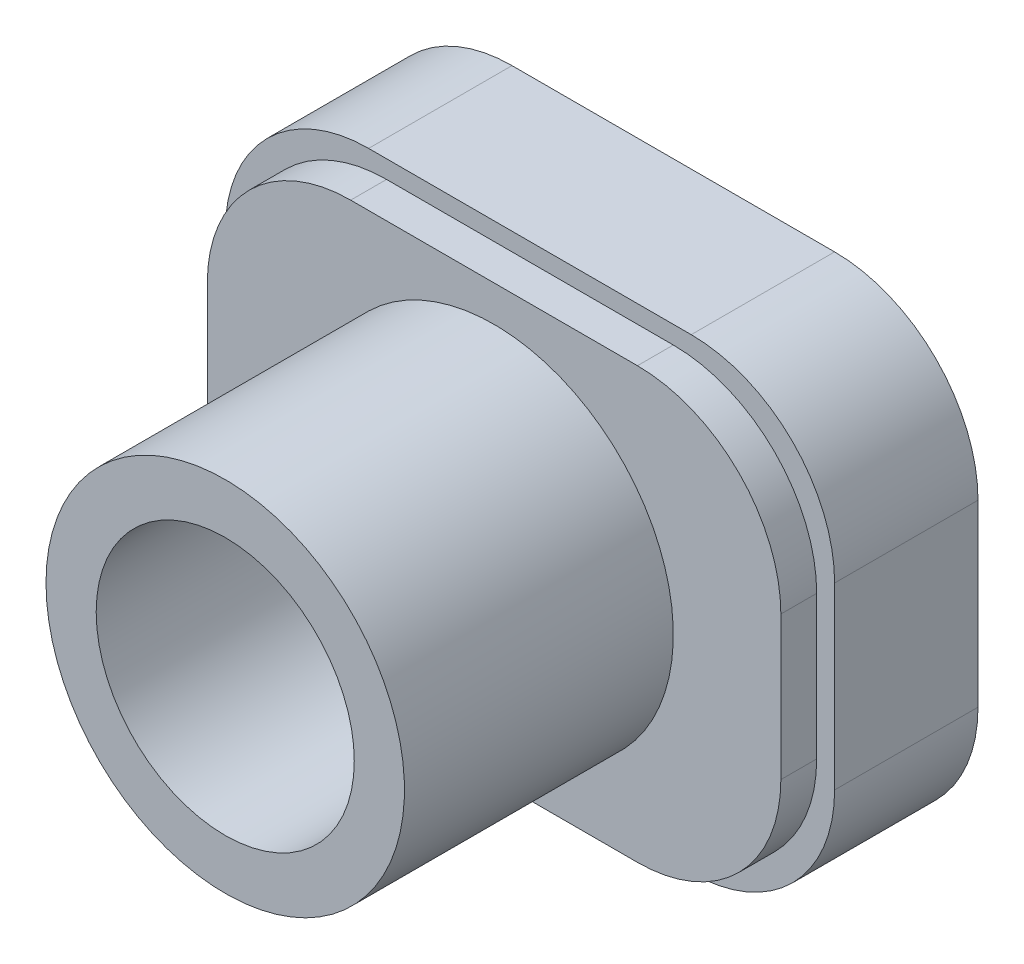
ISO-10303-21;
HEADER;
FILE_DESCRIPTION(('STEP AP214'),'2;1');
FILE_NAME('part.step','',(''),(''),'','','');
FILE_SCHEMA(('AUTOMOTIVE_DESIGN { 1 0 10303 214 1 1 1 1 }'));
ENDSEC;
DATA;
#1=APPLICATION_CONTEXT('core data for automotive mechanical design processes');
#2=APPLICATION_PROTOCOL_DEFINITION('international standard','automotive_design',2000,#1);
#3=PRODUCT_CONTEXT('',#1,'mechanical');
#4=PRODUCT('Part','Part','',(#3));
#5=PRODUCT_RELATED_PRODUCT_CATEGORY('part','',(#4));
#6=PRODUCT_DEFINITION_FORMATION('','',#4);
#7=PRODUCT_DEFINITION_CONTEXT('part definition',#1,'design');
#8=PRODUCT_DEFINITION('design','',#6,#7);
#9=PRODUCT_DEFINITION_SHAPE('','',#8);
#10=(LENGTH_UNIT() NAMED_UNIT(*) SI_UNIT(.MILLI.,.METRE.));
#11=(NAMED_UNIT(*) PLANE_ANGLE_UNIT() SI_UNIT($,.RADIAN.));
#12=(NAMED_UNIT(*) SI_UNIT($,.STERADIAN.) SOLID_ANGLE_UNIT());
#13=UNCERTAINTY_MEASURE_WITH_UNIT(LENGTH_MEASURE(1.E-05),#10,'distance_accuracy_value','');
#14=(GEOMETRIC_REPRESENTATION_CONTEXT(3) GLOBAL_UNCERTAINTY_ASSIGNED_CONTEXT((#13)) GLOBAL_UNIT_ASSIGNED_CONTEXT((#10,
#11,#12)) REPRESENTATION_CONTEXT('',''));
#15=CARTESIAN_POINT('',(0.,0.,0.));
#16=DIRECTION('',(0.,0.,1.));
#17=DIRECTION('',(1.,0.,0.));
#18=AXIS2_PLACEMENT_3D('',#15,#16,#17);
#19=CARTESIAN_POINT('',(-5.715,-3.175,5.08));
#20=DIRECTION('',(0.,0.,1.));
#21=DIRECTION('',(1.,0.,0.));
#22=AXIS2_PLACEMENT_3D('',#19,#20,#21);
#23=PLANE('',#22);
#24=CARTESIAN_POINT('',(-5.08,-2.54,5.08));
#25=DIRECTION('',(0.,0.,1.));
#26=DIRECTION('',(1.,0.,0.));
#27=AXIS2_PLACEMENT_3D('',#24,#25,#26);
#28=CIRCLE('',#27,5.08);
#29=CARTESIAN_POINT('',(-10.16,-2.53999999999996,5.08));
#30=VERTEX_POINT('',#29);
#31=CARTESIAN_POINT('',(-5.07999999999996,-7.62,5.08));
#32=VERTEX_POINT('',#31);
#33=EDGE_CURVE('E55',#30,#32,#28,.T.);
#34=ORIENTED_EDGE('',*,*,#33,.F.);
#35=DIRECTION('',(0.,-1.,0.));
#36=VECTOR('',#35,1.);
#37=CARTESIAN_POINT('',(-10.16,-2.53999999999996,5.08));
#38=LINE('',#37,#36);
#39=CARTESIAN_POINT('',(-10.16,2.53999999999996,5.08));
#40=VERTEX_POINT('',#39);
#41=EDGE_CURVE('E59',#40,#30,#38,.T.);
#42=ORIENTED_EDGE('',*,*,#41,.F.);
#43=CARTESIAN_POINT('',(-5.08,2.54,5.08));
#44=DIRECTION('',(0.,0.,1.));
#45=DIRECTION('',(-1.,0.,0.));
#46=AXIS2_PLACEMENT_3D('',#43,#44,#45);
#47=CIRCLE('',#46,5.08);
#48=CARTESIAN_POINT('',(-5.07999999999997,7.62,5.08));
#49=VERTEX_POINT('',#48);
#50=EDGE_CURVE('E662',#49,#40,#47,.T.);
#51=ORIENTED_EDGE('',*,*,#50,.F.);
#52=DIRECTION('',(-1.,0.,0.));
#53=VECTOR('',#52,1.);
#54=CARTESIAN_POINT('',(5.07999999999996,7.62,5.08));
#55=LINE('',#54,#53);
#56=CARTESIAN_POINT('',(5.07999999999996,7.62,5.08));
#57=VERTEX_POINT('',#56);
#58=EDGE_CURVE('E659',#57,#49,#55,.T.);
#59=ORIENTED_EDGE('',*,*,#58,.F.);
#60=CARTESIAN_POINT('',(5.08,2.54,5.08));
#61=DIRECTION('',(0.,0.,1.));
#62=DIRECTION('',(1.,0.,0.));
#63=AXIS2_PLACEMENT_3D('',#60,#61,#62);
#64=CIRCLE('',#63,5.08);
#65=CARTESIAN_POINT('',(10.16,2.53999999999996,5.08));
#66=VERTEX_POINT('',#65);
#67=EDGE_CURVE('E656',#66,#57,#64,.T.);
#68=ORIENTED_EDGE('',*,*,#67,.F.);
#69=DIRECTION('',(0.,1.,0.));
#70=VECTOR('',#69,1.);
#71=CARTESIAN_POINT('',(10.16,-2.53999999999996,5.08));
#72=LINE('',#71,#70);
#73=CARTESIAN_POINT('',(10.16,-2.53999999999996,5.08));
#74=VERTEX_POINT('',#73);
#75=EDGE_CURVE('E653',#74,#66,#72,.T.);
#76=ORIENTED_EDGE('',*,*,#75,.F.);
#77=CARTESIAN_POINT('',(5.08,-2.54,5.08));
#78=DIRECTION('',(0.,0.,1.));
#79=DIRECTION('',(1.,0.,0.));
#80=AXIS2_PLACEMENT_3D('',#77,#78,#79);
#81=CIRCLE('',#80,5.08);
#82=CARTESIAN_POINT('',(5.07999999999996,-7.62,5.08));
#83=VERTEX_POINT('',#82);
#84=EDGE_CURVE('E650',#83,#74,#81,.T.);
#85=ORIENTED_EDGE('',*,*,#84,.F.);
#86=DIRECTION('',(1.,0.,0.));
#87=VECTOR('',#86,1.);
#88=CARTESIAN_POINT('',(5.07999999999996,-7.62,5.08));
#89=LINE('',#88,#87);
#90=EDGE_CURVE('E648',#32,#83,#89,.T.);
#91=ORIENTED_EDGE('',*,*,#90,.F.);
#92=EDGE_LOOP('',(#34,#42,#51,#59,#68,#76,#85,#91));
#93=FACE_BOUND('',#92,.T.);
#94=CARTESIAN_POINT('',(-5.715,-3.175,5.08));
#95=DIRECTION('',(0.,0.,1.));
#96=DIRECTION('',(1.,0.,0.));
#97=AXIS2_PLACEMENT_3D('',#94,#95,#96);
#98=CIRCLE('',#97,5.08);
#99=CARTESIAN_POINT('',(-10.795,-3.17499999999997,5.08));
#100=VERTEX_POINT('',#99);
#101=CARTESIAN_POINT('',(-5.71499999999996,-8.255,5.08));
#102=VERTEX_POINT('',#101);
#103=EDGE_CURVE('E293',#100,#102,#98,.T.);
#104=ORIENTED_EDGE('',*,*,#103,.T.);
#105=DIRECTION('',(1.,0.,0.));
#106=VECTOR('',#105,1.);
#107=CARTESIAN_POINT('',(5.71499999999996,-8.255,5.08));
#108=LINE('',#107,#106);
#109=CARTESIAN_POINT('',(5.71499999999996,-8.255,5.08));
#110=VERTEX_POINT('',#109);
#111=EDGE_CURVE('E296',#102,#110,#108,.T.);
#112=ORIENTED_EDGE('',*,*,#111,.T.);
#113=CARTESIAN_POINT('',(5.715,-3.175,5.08));
#114=DIRECTION('',(0.,0.,1.));
#115=DIRECTION('',(1.,0.,0.));
#116=AXIS2_PLACEMENT_3D('',#113,#114,#115);
#117=CIRCLE('',#116,5.08);
#118=CARTESIAN_POINT('',(10.795,-3.17499999999996,5.08));
#119=VERTEX_POINT('',#118);
#120=EDGE_CURVE('E299',#110,#119,#117,.T.);
#121=ORIENTED_EDGE('',*,*,#120,.T.);
#122=DIRECTION('',(0.,1.,0.));
#123=VECTOR('',#122,1.);
#124=CARTESIAN_POINT('',(10.795,-3.17499999999996,5.08));
#125=LINE('',#124,#123);
#126=CARTESIAN_POINT('',(10.795,3.17499999999997,5.08));
#127=VERTEX_POINT('',#126);
#128=EDGE_CURVE('E301',#119,#127,#125,.T.);
#129=ORIENTED_EDGE('',*,*,#128,.T.);
#130=CARTESIAN_POINT('',(5.715,3.175,5.08));
#131=DIRECTION('',(0.,0.,1.));
#132=DIRECTION('',(1.,0.,0.));
#133=AXIS2_PLACEMENT_3D('',#130,#131,#132);
#134=CIRCLE('',#133,5.08);
#135=CARTESIAN_POINT('',(5.71499999999996,8.255,5.08));
#136=VERTEX_POINT('',#135);
#137=EDGE_CURVE('E303',#127,#136,#134,.T.);
#138=ORIENTED_EDGE('',*,*,#137,.T.);
#139=DIRECTION('',(-1.,0.,0.));
#140=VECTOR('',#139,1.);
#141=CARTESIAN_POINT('',(5.71499999999996,8.255,5.08));
#142=LINE('',#141,#140);
#143=CARTESIAN_POINT('',(-5.71499999999996,8.255,5.08));
#144=VERTEX_POINT('',#143);
#145=EDGE_CURVE('E305',#136,#144,#142,.T.);
#146=ORIENTED_EDGE('',*,*,#145,.T.);
#147=CARTESIAN_POINT('',(-5.715,3.175,5.08));
#148=DIRECTION('',(0.,0.,1.));
#149=DIRECTION('',(-1.,0.,0.));
#150=AXIS2_PLACEMENT_3D('',#147,#148,#149);
#151=CIRCLE('',#150,5.08);
#152=CARTESIAN_POINT('',(-10.795,3.17499999999997,5.08));
#153=VERTEX_POINT('',#152);
#154=EDGE_CURVE('E307',#144,#153,#151,.T.);
#155=ORIENTED_EDGE('',*,*,#154,.T.);
#156=DIRECTION('',(0.,-1.,0.));
#157=VECTOR('',#156,1.);
#158=CARTESIAN_POINT('',(-10.795,-3.17499999999997,5.08));
#159=LINE('',#158,#157);
#160=EDGE_CURVE('E309',#153,#100,#159,.T.);
#161=ORIENTED_EDGE('',*,*,#160,.T.);
#162=EDGE_LOOP('',(#104,#112,#121,#129,#138,#146,#155,#161));
#163=FACE_BOUND('',#162,.T.);
#164=ADVANCED_FACE('F39',(#93,#163),#23,.T.);
#165=CARTESIAN_POINT('',(-5.715,-3.175,0.));
#166=DIRECTION('',(0.,0.,1.));
#167=DIRECTION('',(1.,0.,0.));
#168=AXIS2_PLACEMENT_3D('',#165,#166,#167);
#169=PLANE('',#168);
#170=CARTESIAN_POINT('',(-5.715,-3.175,0.));
#171=DIRECTION('',(0.,0.,1.));
#172=DIRECTION('',(1.,0.,0.));
#173=AXIS2_PLACEMENT_3D('',#170,#171,#172);
#174=CIRCLE('',#173,5.08);
#175=CARTESIAN_POINT('',(-10.795,-3.17499999999997,0.));
#176=VERTEX_POINT('',#175);
#177=CARTESIAN_POINT('',(-5.71499999999996,-8.255,0.));
#178=VERTEX_POINT('',#177);
#179=EDGE_CURVE('E292',#176,#178,#174,.T.);
#180=ORIENTED_EDGE('',*,*,#179,.F.);
#181=DIRECTION('',(0.,-1.,0.));
#182=VECTOR('',#181,1.);
#183=CARTESIAN_POINT('',(-10.795,-3.17499999999997,0.));
#184=LINE('',#183,#182);
#185=CARTESIAN_POINT('',(-10.795,3.17499999999997,0.));
#186=VERTEX_POINT('',#185);
#187=EDGE_CURVE('E297',#186,#176,#184,.T.);
#188=ORIENTED_EDGE('',*,*,#187,.F.);
#189=CARTESIAN_POINT('',(-5.715,3.175,0.));
#190=DIRECTION('',(0.,0.,1.));
#191=DIRECTION('',(-1.,0.,0.));
#192=AXIS2_PLACEMENT_3D('',#189,#190,#191);
#193=CIRCLE('',#192,5.08);
#194=CARTESIAN_POINT('',(-5.71499999999996,8.255,0.));
#195=VERTEX_POINT('',#194);
#196=EDGE_CURVE('E324',#195,#186,#193,.T.);
#197=ORIENTED_EDGE('',*,*,#196,.F.);
#198=DIRECTION('',(-1.,0.,0.));
#199=VECTOR('',#198,1.);
#200=CARTESIAN_POINT('',(5.71499999999996,8.255,0.));
#201=LINE('',#200,#199);
#202=CARTESIAN_POINT('',(5.71499999999996,8.255,0.));
#203=VERTEX_POINT('',#202);
#204=EDGE_CURVE('E322',#203,#195,#201,.T.);
#205=ORIENTED_EDGE('',*,*,#204,.F.);
#206=CARTESIAN_POINT('',(5.715,3.175,0.));
#207=DIRECTION('',(0.,0.,1.));
#208=DIRECTION('',(1.,0.,0.));
#209=AXIS2_PLACEMENT_3D('',#206,#207,#208);
#210=CIRCLE('',#209,5.08);
#211=CARTESIAN_POINT('',(10.795,3.17499999999997,0.));
#212=VERTEX_POINT('',#211);
#213=EDGE_CURVE('E320',#212,#203,#210,.T.);
#214=ORIENTED_EDGE('',*,*,#213,.F.);
#215=DIRECTION('',(0.,1.,0.));
#216=VECTOR('',#215,1.);
#217=CARTESIAN_POINT('',(10.795,-3.17499999999996,0.));
#218=LINE('',#217,#216);
#219=CARTESIAN_POINT('',(10.795,-3.17499999999996,0.));
#220=VERTEX_POINT('',#219);
#221=EDGE_CURVE('E318',#220,#212,#218,.T.);
#222=ORIENTED_EDGE('',*,*,#221,.F.);
#223=CARTESIAN_POINT('',(5.715,-3.175,0.));
#224=DIRECTION('',(0.,0.,1.));
#225=DIRECTION('',(1.,0.,0.));
#226=AXIS2_PLACEMENT_3D('',#223,#224,#225);
#227=CIRCLE('',#226,5.08);
#228=CARTESIAN_POINT('',(5.71499999999996,-8.255,0.));
#229=VERTEX_POINT('',#228);
#230=EDGE_CURVE('E316',#229,#220,#227,.T.);
#231=ORIENTED_EDGE('',*,*,#230,.F.);
#232=DIRECTION('',(1.,0.,0.));
#233=VECTOR('',#232,1.);
#234=CARTESIAN_POINT('',(5.71499999999996,-8.255,0.));
#235=LINE('',#234,#233);
#236=EDGE_CURVE('E314',#178,#229,#235,.T.);
#237=ORIENTED_EDGE('',*,*,#236,.F.);
#238=EDGE_LOOP('',(#180,#188,#197,#205,#214,#222,#231,#237));
#239=FACE_BOUND('',#238,.T.);
#240=CARTESIAN_POINT('',(3.67,0.919999999999998,0.));
#241=DIRECTION('',(0.,0.,1.));
#242=DIRECTION('',(-1.,0.,0.));
#243=AXIS2_PLACEMENT_3D('',#240,#241,#242);
#244=CIRCLE('',#243,5.08);
#245=CARTESIAN_POINT('',(8.75,0.919999999999998,0.));
#246=VERTEX_POINT('',#245);
#247=CARTESIAN_POINT('',(3.67,6.,0.));
#248=VERTEX_POINT('',#247);
#249=EDGE_CURVE('E221',#246,#248,#244,.T.);
#250=ORIENTED_EDGE('',*,*,#249,.T.);
#251=DIRECTION('',(-1.,0.,0.));
#252=VECTOR('',#251,1.);
#253=CARTESIAN_POINT('',(3.67,6.,0.));
#254=LINE('',#253,#252);
#255=CARTESIAN_POINT('',(-3.67,6.,0.));
#256=VERTEX_POINT('',#255);
#257=EDGE_CURVE('E224',#248,#256,#254,.T.);
#258=ORIENTED_EDGE('',*,*,#257,.T.);
#259=CARTESIAN_POINT('',(-3.67,0.919999999999997,0.));
#260=DIRECTION('',(0.,0.,1.));
#261=DIRECTION('',(-1.,0.,0.));
#262=AXIS2_PLACEMENT_3D('',#259,#260,#261);
#263=CIRCLE('',#262,5.08);
#264=CARTESIAN_POINT('',(-8.75,0.919999999999997,0.));
#265=VERTEX_POINT('',#264);
#266=EDGE_CURVE('E258',#256,#265,#263,.T.);
#267=ORIENTED_EDGE('',*,*,#266,.T.);
#268=DIRECTION('',(0.,-1.,0.));
#269=VECTOR('',#268,1.);
#270=CARTESIAN_POINT('',(-8.75,-0.920000000000002,0.));
#271=LINE('',#270,#269);
#272=CARTESIAN_POINT('',(-8.75,-0.920000000000002,0.));
#273=VERTEX_POINT('',#272);
#274=EDGE_CURVE('E261',#265,#273,#271,.T.);
#275=ORIENTED_EDGE('',*,*,#274,.T.);
#276=CARTESIAN_POINT('',(-3.67,-0.920000000000002,0.));
#277=DIRECTION('',(0.,0.,1.));
#278=DIRECTION('',(-1.,0.,0.));
#279=AXIS2_PLACEMENT_3D('',#276,#277,#278);
#280=CIRCLE('',#279,5.08);
#281=CARTESIAN_POINT('',(-3.67,-6.,0.));
#282=VERTEX_POINT('',#281);
#283=EDGE_CURVE('E264',#273,#282,#280,.T.);
#284=ORIENTED_EDGE('',*,*,#283,.T.);
#285=DIRECTION('',(1.,0.,0.));
#286=VECTOR('',#285,1.);
#287=CARTESIAN_POINT('',(3.67,-6.,0.));
#288=LINE('',#287,#286);
#289=CARTESIAN_POINT('',(3.67,-6.,0.));
#290=VERTEX_POINT('',#289);
#291=EDGE_CURVE('E267',#282,#290,#288,.T.);
#292=ORIENTED_EDGE('',*,*,#291,.T.);
#293=CARTESIAN_POINT('',(3.67,-0.920000000000002,0.));
#294=DIRECTION('',(0.,0.,1.));
#295=DIRECTION('',(-1.,0.,0.));
#296=AXIS2_PLACEMENT_3D('',#293,#294,#295);
#297=CIRCLE('',#296,5.08);
#298=CARTESIAN_POINT('',(8.75,-0.920000000000001,0.));
#299=VERTEX_POINT('',#298);
#300=EDGE_CURVE('E270',#290,#299,#297,.T.);
#301=ORIENTED_EDGE('',*,*,#300,.T.);
#302=DIRECTION('',(0.,1.,0.));
#303=VECTOR('',#302,1.);
#304=CARTESIAN_POINT('',(8.75,-0.920000000000002,0.));
#305=LINE('',#304,#303);
#306=EDGE_CURVE('E234',#299,#246,#305,.T.);
#307=ORIENTED_EDGE('',*,*,#306,.T.);
#308=EDGE_LOOP('',(#250,#258,#267,#275,#284,#292,#301,#307));
#309=FACE_BOUND('',#308,.T.);
#310=ADVANCED_FACE('F359',(#239,#309),#169,.F.);
#311=CARTESIAN_POINT('',(-5.715,-3.175,5.08));
#312=DIRECTION('',(0.,0.,-1.));
#313=DIRECTION('',(-1.,0.,0.));
#314=AXIS2_PLACEMENT_3D('',#311,#312,#313);
#315=CYLINDRICAL_SURFACE('',#314,5.08);
#316=ORIENTED_EDGE('',*,*,#179,.T.);
#317=DIRECTION('',(0.,0.,-1.));
#318=VECTOR('',#317,1.);
#319=CARTESIAN_POINT('',(-5.71499999999996,-8.255,5.08));
#320=LINE('',#319,#318);
#321=EDGE_CURVE('E43',#102,#178,#320,.T.);
#322=ORIENTED_EDGE('',*,*,#321,.F.);
#323=ORIENTED_EDGE('',*,*,#103,.F.);
#324=DIRECTION('',(0.,0.,-1.));
#325=VECTOR('',#324,1.);
#326=CARTESIAN_POINT('',(-10.795,-3.17499999999997,5.08));
#327=LINE('',#326,#325);
#328=EDGE_CURVE('E311',#100,#176,#327,.T.);
#329=ORIENTED_EDGE('',*,*,#328,.T.);
#330=EDGE_LOOP('',(#316,#322,#323,#329));
#331=FACE_BOUND('',#330,.T.);
#332=ADVANCED_FACE('F41',(#331),#315,.T.);
#333=CARTESIAN_POINT('',(5.71499999999996,-8.255,5.08));
#334=DIRECTION('',(0.,1.,0.));
#335=DIRECTION('',(-1.,0.,0.));
#336=AXIS2_PLACEMENT_3D('',#333,#334,#335);
#337=PLANE('',#336);
#338=ORIENTED_EDGE('',*,*,#236,.T.);
#339=DIRECTION('',(0.,0.,-1.));
#340=VECTOR('',#339,1.);
#341=CARTESIAN_POINT('',(5.71499999999996,-8.255,5.08));
#342=LINE('',#341,#340);
#343=EDGE_CURVE('E343',#110,#229,#342,.T.);
#344=ORIENTED_EDGE('',*,*,#343,.F.);
#345=ORIENTED_EDGE('',*,*,#111,.F.);
#346=ORIENTED_EDGE('',*,*,#321,.T.);
#347=EDGE_LOOP('',(#338,#344,#345,#346));
#348=FACE_BOUND('',#347,.T.);
#349=ADVANCED_FACE('F352',(#348),#337,.F.);
#350=CARTESIAN_POINT('',(5.715,-3.175,5.08));
#351=DIRECTION('',(0.,0.,-1.));
#352=DIRECTION('',(-1.,0.,0.));
#353=AXIS2_PLACEMENT_3D('',#350,#351,#352);
#354=CYLINDRICAL_SURFACE('',#353,5.08);
#355=ORIENTED_EDGE('',*,*,#230,.T.);
#356=DIRECTION('',(0.,0.,-1.));
#357=VECTOR('',#356,1.);
#358=CARTESIAN_POINT('',(10.795,-3.17499999999996,5.08));
#359=LINE('',#358,#357);
#360=EDGE_CURVE('E341',#119,#220,#359,.T.);
#361=ORIENTED_EDGE('',*,*,#360,.F.);
#362=ORIENTED_EDGE('',*,*,#120,.F.);
#363=ORIENTED_EDGE('',*,*,#343,.T.);
#364=EDGE_LOOP('',(#355,#361,#362,#363));
#365=FACE_BOUND('',#364,.T.);
#366=ADVANCED_FACE('F365',(#365),#354,.T.);
#367=CARTESIAN_POINT('',(10.795,-3.17499999999996,5.08));
#368=DIRECTION('',(-1.,0.,0.));
#369=DIRECTION('',(0.,0.,1.));
#370=AXIS2_PLACEMENT_3D('',#367,#368,#369);
#371=PLANE('',#370);
#372=ORIENTED_EDGE('',*,*,#221,.T.);
#373=DIRECTION('',(0.,0.,-1.));
#374=VECTOR('',#373,1.);
#375=CARTESIAN_POINT('',(10.795,3.17499999999997,5.08));
#376=LINE('',#375,#374);
#377=EDGE_CURVE('E338',#127,#212,#376,.T.);
#378=ORIENTED_EDGE('',*,*,#377,.F.);
#379=ORIENTED_EDGE('',*,*,#128,.F.);
#380=ORIENTED_EDGE('',*,*,#360,.T.);
#381=EDGE_LOOP('',(#372,#378,#379,#380));
#382=FACE_BOUND('',#381,.T.);
#383=ADVANCED_FACE('F368',(#382),#371,.F.);
#384=CARTESIAN_POINT('',(5.715,3.175,5.08));
#385=DIRECTION('',(0.,0.,-1.));
#386=DIRECTION('',(-1.,0.,0.));
#387=AXIS2_PLACEMENT_3D('',#384,#385,#386);
#388=CYLINDRICAL_SURFACE('',#387,5.08);
#389=ORIENTED_EDGE('',*,*,#213,.T.);
#390=DIRECTION('',(0.,0.,-1.));
#391=VECTOR('',#390,1.);
#392=CARTESIAN_POINT('',(5.71499999999996,8.255,5.08));
#393=LINE('',#392,#391);
#394=EDGE_CURVE('E335',#136,#203,#393,.T.);
#395=ORIENTED_EDGE('',*,*,#394,.F.);
#396=ORIENTED_EDGE('',*,*,#137,.F.);
#397=ORIENTED_EDGE('',*,*,#377,.T.);
#398=EDGE_LOOP('',(#389,#395,#396,#397));
#399=FACE_BOUND('',#398,.T.);
#400=ADVANCED_FACE('F386',(#399),#388,.T.);
#401=CARTESIAN_POINT('',(5.71499999999996,8.255,5.08));
#402=DIRECTION('',(0.,-1.,0.));
#403=DIRECTION('',(1.,0.,0.));
#404=AXIS2_PLACEMENT_3D('',#401,#402,#403);
#405=PLANE('',#404);
#406=ORIENTED_EDGE('',*,*,#204,.T.);
#407=DIRECTION('',(0.,0.,-1.));
#408=VECTOR('',#407,1.);
#409=CARTESIAN_POINT('',(-5.71499999999996,8.255,5.08));
#410=LINE('',#409,#408);
#411=EDGE_CURVE('E332',#144,#195,#410,.T.);
#412=ORIENTED_EDGE('',*,*,#411,.F.);
#413=ORIENTED_EDGE('',*,*,#145,.F.);
#414=ORIENTED_EDGE('',*,*,#394,.T.);
#415=EDGE_LOOP('',(#406,#412,#413,#414));
#416=FACE_BOUND('',#415,.T.);
#417=ADVANCED_FACE('F383',(#416),#405,.F.);
#418=CARTESIAN_POINT('',(-5.715,3.175,5.08));
#419=DIRECTION('',(0.,0.,-1.));
#420=DIRECTION('',(-1.,0.,0.));
#421=AXIS2_PLACEMENT_3D('',#418,#419,#420);
#422=CYLINDRICAL_SURFACE('',#421,5.08);
#423=ORIENTED_EDGE('',*,*,#196,.T.);
#424=DIRECTION('',(0.,0.,-1.));
#425=VECTOR('',#424,1.);
#426=CARTESIAN_POINT('',(-10.795,3.17499999999997,5.08));
#427=LINE('',#426,#425);
#428=EDGE_CURVE('E329',#153,#186,#427,.T.);
#429=ORIENTED_EDGE('',*,*,#428,.F.);
#430=ORIENTED_EDGE('',*,*,#154,.F.);
#431=ORIENTED_EDGE('',*,*,#411,.T.);
#432=EDGE_LOOP('',(#423,#429,#430,#431));
#433=FACE_BOUND('',#432,.T.);
#434=ADVANCED_FACE('F379',(#433),#422,.T.);
#435=CARTESIAN_POINT('',(-10.795,-3.17499999999997,5.08));
#436=DIRECTION('',(1.,0.,0.));
#437=DIRECTION('',(0.,0.,-1.));
#438=AXIS2_PLACEMENT_3D('',#435,#436,#437);
#439=PLANE('',#438);
#440=ORIENTED_EDGE('',*,*,#187,.T.);
#441=ORIENTED_EDGE('',*,*,#328,.F.);
#442=ORIENTED_EDGE('',*,*,#160,.F.);
#443=ORIENTED_EDGE('',*,*,#428,.T.);
#444=EDGE_LOOP('',(#440,#441,#442,#443));
#445=FACE_BOUND('',#444,.T.);
#446=ADVANCED_FACE('F377',(#445),#439,.F.);
#447=CARTESIAN_POINT('',(3.67,0.919999999999998,5.08));
#448=DIRECTION('',(0.,0.,-1.));
#449=DIRECTION('',(-1.,0.,0.));
#450=AXIS2_PLACEMENT_3D('',#447,#448,#449);
#451=CYLINDRICAL_SURFACE('',#450,5.08);
#452=ORIENTED_EDGE('',*,*,#249,.F.);
#453=DIRECTION('',(0.,0.,-1.));
#454=VECTOR('',#453,1.);
#455=CARTESIAN_POINT('',(8.75,0.919999999999998,5.08));
#456=LINE('',#455,#454);
#457=CARTESIAN_POINT('',(8.75,0.919999999999998,5.08));
#458=VERTEX_POINT('',#457);
#459=EDGE_CURVE('E254',#458,#246,#456,.T.);
#460=ORIENTED_EDGE('',*,*,#459,.F.);
#461=CARTESIAN_POINT('',(3.67,0.919999999999998,5.08));
#462=DIRECTION('',(0.,0.,1.));
#463=DIRECTION('',(-1.,0.,0.));
#464=AXIS2_PLACEMENT_3D('',#461,#462,#463);
#465=CIRCLE('',#464,5.08);
#466=CARTESIAN_POINT('',(3.67,6.,5.08));
#467=VERTEX_POINT('',#466);
#468=EDGE_CURVE('E230',#458,#467,#465,.T.);
#469=ORIENTED_EDGE('',*,*,#468,.T.);
#470=DIRECTION('',(0.,0.,-1.));
#471=VECTOR('',#470,1.);
#472=CARTESIAN_POINT('',(3.67,6.,5.08));
#473=LINE('',#472,#471);
#474=EDGE_CURVE('E289',#467,#248,#473,.T.);
#475=ORIENTED_EDGE('',*,*,#474,.T.);
#476=EDGE_LOOP('',(#452,#460,#469,#475));
#477=FACE_BOUND('',#476,.T.);
#478=ADVANCED_FACE('F404',(#477),#451,.F.);
#479=CARTESIAN_POINT('',(3.67,6.,5.08));
#480=DIRECTION('',(0.,-1.,0.));
#481=DIRECTION('',(1.,0.,0.));
#482=AXIS2_PLACEMENT_3D('',#479,#480,#481);
#483=PLANE('',#482);
#484=ORIENTED_EDGE('',*,*,#257,.F.);
#485=ORIENTED_EDGE('',*,*,#474,.F.);
#486=DIRECTION('',(-1.,0.,0.));
#487=VECTOR('',#486,1.);
#488=CARTESIAN_POINT('',(3.67,6.,5.08));
#489=LINE('',#488,#487);
#490=CARTESIAN_POINT('',(-3.67,6.,5.08));
#491=VERTEX_POINT('',#490);
#492=EDGE_CURVE('E233',#467,#491,#489,.T.);
#493=ORIENTED_EDGE('',*,*,#492,.T.);
#494=DIRECTION('',(0.,0.,-1.));
#495=VECTOR('',#494,1.);
#496=CARTESIAN_POINT('',(-3.67,6.,5.08));
#497=LINE('',#496,#495);
#498=EDGE_CURVE('E287',#491,#256,#497,.T.);
#499=ORIENTED_EDGE('',*,*,#498,.T.);
#500=EDGE_LOOP('',(#484,#485,#493,#499));
#501=FACE_BOUND('',#500,.T.);
#502=ADVANCED_FACE('F427',(#501),#483,.T.);
#503=CARTESIAN_POINT('',(-3.67,0.919999999999997,5.08));
#504=DIRECTION('',(0.,0.,-1.));
#505=DIRECTION('',(-1.,0.,0.));
#506=AXIS2_PLACEMENT_3D('',#503,#504,#505);
#507=CYLINDRICAL_SURFACE('',#506,5.08);
#508=ORIENTED_EDGE('',*,*,#266,.F.);
#509=ORIENTED_EDGE('',*,*,#498,.F.);
#510=CARTESIAN_POINT('',(-3.67,0.919999999999997,5.08));
#511=DIRECTION('',(0.,0.,1.));
#512=DIRECTION('',(-1.,0.,0.));
#513=AXIS2_PLACEMENT_3D('',#510,#511,#512);
#514=CIRCLE('',#513,5.08);
#515=CARTESIAN_POINT('',(-8.75,0.919999999999997,5.08));
#516=VERTEX_POINT('',#515);
#517=EDGE_CURVE('E237',#491,#516,#514,.T.);
#518=ORIENTED_EDGE('',*,*,#517,.T.);
#519=DIRECTION('',(0.,0.,-1.));
#520=VECTOR('',#519,1.);
#521=CARTESIAN_POINT('',(-8.75,0.919999999999997,5.08));
#522=LINE('',#521,#520);
#523=EDGE_CURVE('E285',#516,#265,#522,.T.);
#524=ORIENTED_EDGE('',*,*,#523,.T.);
#525=EDGE_LOOP('',(#508,#509,#518,#524));
#526=FACE_BOUND('',#525,.T.);
#527=ADVANCED_FACE('F436',(#526),#507,.F.);
#528=CARTESIAN_POINT('',(-8.75,-0.920000000000002,5.08));
#529=DIRECTION('',(1.,0.,0.));
#530=DIRECTION('',(0.,1.,0.));
#531=AXIS2_PLACEMENT_3D('',#528,#529,#530);
#532=PLANE('',#531);
#533=ORIENTED_EDGE('',*,*,#274,.F.);
#534=ORIENTED_EDGE('',*,*,#523,.F.);
#535=DIRECTION('',(0.,-1.,0.));
#536=VECTOR('',#535,1.);
#537=CARTESIAN_POINT('',(-8.75,-0.920000000000002,5.08));
#538=LINE('',#537,#536);
#539=CARTESIAN_POINT('',(-8.75,-0.920000000000002,5.08));
#540=VERTEX_POINT('',#539);
#541=EDGE_CURVE('E240',#516,#540,#538,.T.);
#542=ORIENTED_EDGE('',*,*,#541,.T.);
#543=DIRECTION('',(0.,0.,-1.));
#544=VECTOR('',#543,1.);
#545=CARTESIAN_POINT('',(-8.75,-0.920000000000002,5.08));
#546=LINE('',#545,#544);
#547=EDGE_CURVE('E283',#540,#273,#546,.T.);
#548=ORIENTED_EDGE('',*,*,#547,.T.);
#549=EDGE_LOOP('',(#533,#534,#542,#548));
#550=FACE_BOUND('',#549,.T.);
#551=ADVANCED_FACE('F445',(#550),#532,.T.);
#552=CARTESIAN_POINT('',(-3.67,-0.920000000000002,5.08));
#553=DIRECTION('',(0.,0.,-1.));
#554=DIRECTION('',(-1.,0.,0.));
#555=AXIS2_PLACEMENT_3D('',#552,#553,#554);
#556=CYLINDRICAL_SURFACE('',#555,5.08);
#557=ORIENTED_EDGE('',*,*,#283,.F.);
#558=ORIENTED_EDGE('',*,*,#547,.F.);
#559=CARTESIAN_POINT('',(-3.67,-0.920000000000002,5.08));
#560=DIRECTION('',(0.,0.,1.));
#561=DIRECTION('',(-1.,0.,0.));
#562=AXIS2_PLACEMENT_3D('',#559,#560,#561);
#563=CIRCLE('',#562,5.08);
#564=CARTESIAN_POINT('',(-3.67,-6.,5.08));
#565=VERTEX_POINT('',#564);
#566=EDGE_CURVE('E243',#540,#565,#563,.T.);
#567=ORIENTED_EDGE('',*,*,#566,.T.);
#568=DIRECTION('',(0.,0.,-1.));
#569=VECTOR('',#568,1.);
#570=CARTESIAN_POINT('',(-3.67,-6.,5.08));
#571=LINE('',#570,#569);
#572=EDGE_CURVE('E281',#565,#282,#571,.T.);
#573=ORIENTED_EDGE('',*,*,#572,.T.);
#574=EDGE_LOOP('',(#557,#558,#567,#573));
#575=FACE_BOUND('',#574,.T.);
#576=ADVANCED_FACE('F455',(#575),#556,.F.);
#577=CARTESIAN_POINT('',(3.67,-6.,5.08));
#578=DIRECTION('',(0.,1.,0.));
#579=DIRECTION('',(-1.,0.,0.));
#580=AXIS2_PLACEMENT_3D('',#577,#578,#579);
#581=PLANE('',#580);
#582=ORIENTED_EDGE('',*,*,#291,.F.);
#583=ORIENTED_EDGE('',*,*,#572,.F.);
#584=DIRECTION('',(1.,0.,0.));
#585=VECTOR('',#584,1.);
#586=CARTESIAN_POINT('',(3.67,-6.,5.08));
#587=LINE('',#586,#585);
#588=CARTESIAN_POINT('',(3.67,-6.,5.08));
#589=VERTEX_POINT('',#588);
#590=EDGE_CURVE('E246',#565,#589,#587,.T.);
#591=ORIENTED_EDGE('',*,*,#590,.T.);
#592=DIRECTION('',(0.,0.,-1.));
#593=VECTOR('',#592,1.);
#594=CARTESIAN_POINT('',(3.67,-6.,5.08));
#595=LINE('',#594,#593);
#596=EDGE_CURVE('E279',#589,#290,#595,.T.);
#597=ORIENTED_EDGE('',*,*,#596,.T.);
#598=EDGE_LOOP('',(#582,#583,#591,#597));
#599=FACE_BOUND('',#598,.T.);
#600=ADVANCED_FACE('F465',(#599),#581,.T.);
#601=CARTESIAN_POINT('',(3.67,-0.920000000000002,5.08));
#602=DIRECTION('',(0.,0.,-1.));
#603=DIRECTION('',(-1.,0.,0.));
#604=AXIS2_PLACEMENT_3D('',#601,#602,#603);
#605=CYLINDRICAL_SURFACE('',#604,5.08);
#606=ORIENTED_EDGE('',*,*,#300,.F.);
#607=ORIENTED_EDGE('',*,*,#596,.F.);
#608=CARTESIAN_POINT('',(3.67,-0.920000000000002,5.08));
#609=DIRECTION('',(0.,0.,1.));
#610=DIRECTION('',(-1.,0.,0.));
#611=AXIS2_PLACEMENT_3D('',#608,#609,#610);
#612=CIRCLE('',#611,5.08);
#613=CARTESIAN_POINT('',(8.75,-0.920000000000001,5.08));
#614=VERTEX_POINT('',#613);
#615=EDGE_CURVE('E249',#589,#614,#612,.T.);
#616=ORIENTED_EDGE('',*,*,#615,.T.);
#617=DIRECTION('',(0.,0.,-1.));
#618=VECTOR('',#617,1.);
#619=CARTESIAN_POINT('',(8.75,-0.920000000000001,5.08));
#620=LINE('',#619,#618);
#621=EDGE_CURVE('E277',#614,#299,#620,.T.);
#622=ORIENTED_EDGE('',*,*,#621,.T.);
#623=EDGE_LOOP('',(#606,#607,#616,#622));
#624=FACE_BOUND('',#623,.T.);
#625=ADVANCED_FACE('F475',(#624),#605,.F.);
#626=CARTESIAN_POINT('',(8.75,-0.920000000000002,5.08));
#627=DIRECTION('',(-1.,0.,0.));
#628=DIRECTION('',(0.,-1.,0.));
#629=AXIS2_PLACEMENT_3D('',#626,#627,#628);
#630=PLANE('',#629);
#631=ORIENTED_EDGE('',*,*,#306,.F.);
#632=ORIENTED_EDGE('',*,*,#621,.F.);
#633=DIRECTION('',(0.,1.,0.));
#634=VECTOR('',#633,1.);
#635=CARTESIAN_POINT('',(8.75,-0.920000000000002,5.08));
#636=LINE('',#635,#634);
#637=EDGE_CURVE('E252',#614,#458,#636,.T.);
#638=ORIENTED_EDGE('',*,*,#637,.T.);
#639=ORIENTED_EDGE('',*,*,#459,.T.);
#640=EDGE_LOOP('',(#631,#632,#638,#639));
#641=FACE_BOUND('',#640,.T.);
#642=ADVANCED_FACE('F485',(#641),#630,.T.);
#643=CARTESIAN_POINT('',(-5.08,-2.54,6.35));
#644=DIRECTION('',(0.,0.,1.));
#645=DIRECTION('',(1.,0.,0.));
#646=AXIS2_PLACEMENT_3D('',#643,#644,#645);
#647=PLANE('',#646);
#648=CARTESIAN_POINT('',(0.,0.,6.35));
#649=DIRECTION('',(0.,0.,1.));
#650=DIRECTION('',(1.,0.,0.));
#651=AXIS2_PLACEMENT_3D('',#648,#649,#650);
#652=CIRCLE('',#651,6.35);
#653=CARTESIAN_POINT('',(-6.35,0.,6.35));
#654=VERTEX_POINT('',#653);
#655=EDGE_CURVE('E11',#654,#654,#652,.T.);
#656=ORIENTED_EDGE('',*,*,#655,.F.);
#657=EDGE_LOOP('',(#656));
#658=FACE_BOUND('',#657,.T.);
#659=CARTESIAN_POINT('',(-5.08,-2.54,6.35));
#660=DIRECTION('',(0.,0.,1.));
#661=DIRECTION('',(1.,0.,0.));
#662=AXIS2_PLACEMENT_3D('',#659,#660,#661);
#663=CIRCLE('',#662,5.08);
#664=CARTESIAN_POINT('',(-10.16,-2.53999999999996,6.35));
#665=VERTEX_POINT('',#664);
#666=CARTESIAN_POINT('',(-5.07999999999996,-7.62,6.35));
#667=VERTEX_POINT('',#666);
#668=EDGE_CURVE('E210',#665,#667,#663,.T.);
#669=ORIENTED_EDGE('',*,*,#668,.T.);
#670=DIRECTION('',(1.,0.,0.));
#671=VECTOR('',#670,1.);
#672=CARTESIAN_POINT('',(5.07999999999996,-7.62,6.35));
#673=LINE('',#672,#671);
#674=CARTESIAN_POINT('',(5.07999999999996,-7.62,6.35));
#675=VERTEX_POINT('',#674);
#676=EDGE_CURVE('E199',#667,#675,#673,.T.);
#677=ORIENTED_EDGE('',*,*,#676,.T.);
#678=CARTESIAN_POINT('',(5.08,-2.54,6.35));
#679=DIRECTION('',(0.,0.,1.));
#680=DIRECTION('',(1.,0.,0.));
#681=AXIS2_PLACEMENT_3D('',#678,#679,#680);
#682=CIRCLE('',#681,5.08);
#683=CARTESIAN_POINT('',(10.16,-2.53999999999996,6.35));
#684=VERTEX_POINT('',#683);
#685=EDGE_CURVE('E209',#675,#684,#682,.T.);
#686=ORIENTED_EDGE('',*,*,#685,.T.);
#687=DIRECTION('',(0.,1.,0.));
#688=VECTOR('',#687,1.);
#689=CARTESIAN_POINT('',(10.16,-2.53999999999996,6.35));
#690=LINE('',#689,#688);
#691=CARTESIAN_POINT('',(10.16,2.53999999999996,6.35));
#692=VERTEX_POINT('',#691);
#693=EDGE_CURVE('E637',#684,#692,#690,.T.);
#694=ORIENTED_EDGE('',*,*,#693,.T.);
#695=CARTESIAN_POINT('',(5.08,2.54,6.35));
#696=DIRECTION('',(0.,0.,1.));
#697=DIRECTION('',(1.,0.,0.));
#698=AXIS2_PLACEMENT_3D('',#695,#696,#697);
#699=CIRCLE('',#698,5.08);
#700=CARTESIAN_POINT('',(5.07999999999996,7.62,6.35));
#701=VERTEX_POINT('',#700);
#702=EDGE_CURVE('E639',#692,#701,#699,.T.);
#703=ORIENTED_EDGE('',*,*,#702,.T.);
#704=DIRECTION('',(-1.,0.,0.));
#705=VECTOR('',#704,1.);
#706=CARTESIAN_POINT('',(5.07999999999996,7.62,6.35));
#707=LINE('',#706,#705);
#708=CARTESIAN_POINT('',(-5.07999999999997,7.62,6.35));
#709=VERTEX_POINT('',#708);
#710=EDGE_CURVE('E641',#701,#709,#707,.T.);
#711=ORIENTED_EDGE('',*,*,#710,.T.);
#712=CARTESIAN_POINT('',(-5.08,2.54,6.35));
#713=DIRECTION('',(0.,0.,1.));
#714=DIRECTION('',(-1.,0.,0.));
#715=AXIS2_PLACEMENT_3D('',#712,#713,#714);
#716=CIRCLE('',#715,5.08);
#717=CARTESIAN_POINT('',(-10.16,2.53999999999996,6.35));
#718=VERTEX_POINT('',#717);
#719=EDGE_CURVE('E643',#709,#718,#716,.T.);
#720=ORIENTED_EDGE('',*,*,#719,.T.);
#721=DIRECTION('',(0.,-1.,0.));
#722=VECTOR('',#721,1.);
#723=CARTESIAN_POINT('',(-10.16,-2.53999999999996,6.35));
#724=LINE('',#723,#722);
#725=EDGE_CURVE('E215',#718,#665,#724,.T.);
#726=ORIENTED_EDGE('',*,*,#725,.T.);
#727=EDGE_LOOP('',(#669,#677,#686,#694,#703,#711,#720,#726));
#728=FACE_BOUND('',#727,.T.);
#729=ADVANCED_FACE('F213',(#658,#728),#647,.T.);
#730=CARTESIAN_POINT('',(-10.16,-2.53999999999996,6.35));
#731=DIRECTION('',(1.,0.,0.));
#732=DIRECTION('',(0.,0.,-1.));
#733=AXIS2_PLACEMENT_3D('',#730,#731,#732);
#734=PLANE('',#733);
#735=ORIENTED_EDGE('',*,*,#41,.T.);
#736=DIRECTION('',(0.,0.,-1.));
#737=VECTOR('',#736,1.);
#738=CARTESIAN_POINT('',(-10.16,-2.53999999999996,6.35));
#739=LINE('',#738,#737);
#740=EDGE_CURVE('E646',#665,#30,#739,.T.);
#741=ORIENTED_EDGE('',*,*,#740,.F.);
#742=ORIENTED_EDGE('',*,*,#725,.F.);
#743=DIRECTION('',(0.,0.,-1.));
#744=VECTOR('',#743,1.);
#745=CARTESIAN_POINT('',(-10.16,2.53999999999996,6.35));
#746=LINE('',#745,#744);
#747=EDGE_CURVE('E666',#718,#40,#746,.T.);
#748=ORIENTED_EDGE('',*,*,#747,.T.);
#749=EDGE_LOOP('',(#735,#741,#742,#748));
#750=FACE_BOUND('',#749,.T.);
#751=ADVANCED_FACE('F505',(#750),#734,.F.);
#752=CARTESIAN_POINT('',(-5.08,2.54,6.35));
#753=DIRECTION('',(0.,0.,-1.));
#754=DIRECTION('',(-1.,0.,0.));
#755=AXIS2_PLACEMENT_3D('',#752,#753,#754);
#756=CYLINDRICAL_SURFACE('',#755,5.08);
#757=ORIENTED_EDGE('',*,*,#50,.T.);
#758=ORIENTED_EDGE('',*,*,#747,.F.);
#759=ORIENTED_EDGE('',*,*,#719,.F.);
#760=DIRECTION('',(0.,0.,-1.));
#761=VECTOR('',#760,1.);
#762=CARTESIAN_POINT('',(-5.07999999999997,7.62,6.35));
#763=LINE('',#762,#761);
#764=EDGE_CURVE('E669',#709,#49,#763,.T.);
#765=ORIENTED_EDGE('',*,*,#764,.T.);
#766=EDGE_LOOP('',(#757,#758,#759,#765));
#767=FACE_BOUND('',#766,.T.);
#768=ADVANCED_FACE('F516',(#767),#756,.T.);
#769=CARTESIAN_POINT('',(5.07999999999996,7.62,6.35));
#770=DIRECTION('',(0.,-1.,0.));
#771=DIRECTION('',(1.,0.,0.));
#772=AXIS2_PLACEMENT_3D('',#769,#770,#771);
#773=PLANE('',#772);
#774=ORIENTED_EDGE('',*,*,#58,.T.);
#775=ORIENTED_EDGE('',*,*,#764,.F.);
#776=ORIENTED_EDGE('',*,*,#710,.F.);
#777=DIRECTION('',(0.,0.,-1.));
#778=VECTOR('',#777,1.);
#779=CARTESIAN_POINT('',(5.07999999999996,7.62,6.35));
#780=LINE('',#779,#778);
#781=EDGE_CURVE('E672',#701,#57,#780,.T.);
#782=ORIENTED_EDGE('',*,*,#781,.T.);
#783=EDGE_LOOP('',(#774,#775,#776,#782));
#784=FACE_BOUND('',#783,.T.);
#785=ADVANCED_FACE('F526',(#784),#773,.F.);
#786=CARTESIAN_POINT('',(5.08,2.54,6.35));
#787=DIRECTION('',(0.,0.,-1.));
#788=DIRECTION('',(-1.,0.,0.));
#789=AXIS2_PLACEMENT_3D('',#786,#787,#788);
#790=CYLINDRICAL_SURFACE('',#789,5.08);
#791=ORIENTED_EDGE('',*,*,#67,.T.);
#792=ORIENTED_EDGE('',*,*,#781,.F.);
#793=ORIENTED_EDGE('',*,*,#702,.F.);
#794=DIRECTION('',(0.,0.,-1.));
#795=VECTOR('',#794,1.);
#796=CARTESIAN_POINT('',(10.16,2.53999999999996,6.35));
#797=LINE('',#796,#795);
#798=EDGE_CURVE('E675',#692,#66,#797,.T.);
#799=ORIENTED_EDGE('',*,*,#798,.T.);
#800=EDGE_LOOP('',(#791,#792,#793,#799));
#801=FACE_BOUND('',#800,.T.);
#802=ADVANCED_FACE('F536',(#801),#790,.T.);
#803=CARTESIAN_POINT('',(10.16,-2.53999999999996,6.35));
#804=DIRECTION('',(-1.,0.,0.));
#805=DIRECTION('',(0.,0.,1.));
#806=AXIS2_PLACEMENT_3D('',#803,#804,#805);
#807=PLANE('',#806);
#808=ORIENTED_EDGE('',*,*,#75,.T.);
#809=ORIENTED_EDGE('',*,*,#798,.F.);
#810=ORIENTED_EDGE('',*,*,#693,.F.);
#811=DIRECTION('',(0.,0.,-1.));
#812=VECTOR('',#811,1.);
#813=CARTESIAN_POINT('',(10.16,-2.53999999999996,6.35));
#814=LINE('',#813,#812);
#815=EDGE_CURVE('E226',#684,#74,#814,.T.);
#816=ORIENTED_EDGE('',*,*,#815,.T.);
#817=EDGE_LOOP('',(#808,#809,#810,#816));
#818=FACE_BOUND('',#817,.T.);
#819=ADVANCED_FACE('F546',(#818),#807,.F.);
#820=CARTESIAN_POINT('',(5.08,-2.54,6.35));
#821=DIRECTION('',(0.,0.,-1.));
#822=DIRECTION('',(-1.,0.,0.));
#823=AXIS2_PLACEMENT_3D('',#820,#821,#822);
#824=CYLINDRICAL_SURFACE('',#823,5.08);
#825=ORIENTED_EDGE('',*,*,#84,.T.);
#826=ORIENTED_EDGE('',*,*,#815,.F.);
#827=ORIENTED_EDGE('',*,*,#685,.F.);
#828=DIRECTION('',(0.,0.,-1.));
#829=VECTOR('',#828,1.);
#830=CARTESIAN_POINT('',(5.07999999999996,-7.62,6.35));
#831=LINE('',#830,#829);
#832=EDGE_CURVE('E206',#675,#83,#831,.T.);
#833=ORIENTED_EDGE('',*,*,#832,.T.);
#834=EDGE_LOOP('',(#825,#826,#827,#833));
#835=FACE_BOUND('',#834,.T.);
#836=ADVANCED_FACE('F556',(#835),#824,.T.);
#837=CARTESIAN_POINT('',(5.07999999999996,-7.62,6.35));
#838=DIRECTION('',(0.,1.,0.));
#839=DIRECTION('',(-1.,0.,0.));
#840=AXIS2_PLACEMENT_3D('',#837,#838,#839);
#841=PLANE('',#840);
#842=ORIENTED_EDGE('',*,*,#90,.T.);
#843=ORIENTED_EDGE('',*,*,#832,.F.);
#844=ORIENTED_EDGE('',*,*,#676,.F.);
#845=DIRECTION('',(0.,0.,-1.));
#846=VECTOR('',#845,1.);
#847=CARTESIAN_POINT('',(-5.07999999999996,-7.62,6.35));
#848=LINE('',#847,#846);
#849=EDGE_CURVE('E204',#667,#32,#848,.T.);
#850=ORIENTED_EDGE('',*,*,#849,.T.);
#851=EDGE_LOOP('',(#842,#843,#844,#850));
#852=FACE_BOUND('',#851,.T.);
#853=ADVANCED_FACE('F202',(#852),#841,.F.);
#854=CARTESIAN_POINT('',(-5.08,-2.54,6.35));
#855=DIRECTION('',(0.,0.,-1.));
#856=DIRECTION('',(-1.,0.,0.));
#857=AXIS2_PLACEMENT_3D('',#854,#855,#856);
#858=CYLINDRICAL_SURFACE('',#857,5.08);
#859=ORIENTED_EDGE('',*,*,#33,.T.);
#860=ORIENTED_EDGE('',*,*,#849,.F.);
#861=ORIENTED_EDGE('',*,*,#668,.F.);
#862=ORIENTED_EDGE('',*,*,#740,.T.);
#863=EDGE_LOOP('',(#859,#860,#861,#862));
#864=FACE_BOUND('',#863,.T.);
#865=ADVANCED_FACE('F220',(#864),#858,.T.);
#866=CARTESIAN_POINT('',(-5.08,-2.54,5.08));
#867=DIRECTION('',(0.,0.,1.));
#868=DIRECTION('',(1.,0.,0.));
#869=AXIS2_PLACEMENT_3D('',#866,#867,#868);
#870=PLANE('',#869);
#871=CARTESIAN_POINT('',(0.,0.,5.08));
#872=DIRECTION('',(0.,0.,1.));
#873=DIRECTION('',(1.,0.,0.));
#874=AXIS2_PLACEMENT_3D('',#871,#872,#873);
#875=CIRCLE('',#874,4.572);
#876=CARTESIAN_POINT('',(4.572,0.,5.08));
#877=VERTEX_POINT('',#876);
#878=EDGE_CURVE('E629',#877,#877,#875,.T.);
#879=ORIENTED_EDGE('',*,*,#878,.T.);
#880=EDGE_LOOP('',(#879));
#881=FACE_BOUND('',#880,.T.);
#882=ORIENTED_EDGE('',*,*,#492,.F.);
#883=ORIENTED_EDGE('',*,*,#468,.F.);
#884=ORIENTED_EDGE('',*,*,#637,.F.);
#885=ORIENTED_EDGE('',*,*,#615,.F.);
#886=ORIENTED_EDGE('',*,*,#590,.F.);
#887=ORIENTED_EDGE('',*,*,#566,.F.);
#888=ORIENTED_EDGE('',*,*,#541,.F.);
#889=ORIENTED_EDGE('',*,*,#517,.F.);
#890=EDGE_LOOP('',(#882,#883,#884,#885,#886,#887,#888,#889));
#891=FACE_BOUND('',#890,.T.);
#892=ADVANCED_FACE('F582',(#881,#891),#870,.F.);
#893=CARTESIAN_POINT('',(0.,0.,15.875));
#894=DIRECTION('',(0.,0.,-1.));
#895=DIRECTION('',(-1.,0.,0.));
#896=AXIS2_PLACEMENT_3D('',#893,#894,#895);
#897=CYLINDRICAL_SURFACE('',#896,6.35);
#898=CARTESIAN_POINT('',(0.,0.,15.875));
#899=DIRECTION('',(0.,0.,1.));
#900=DIRECTION('',(1.,0.,0.));
#901=AXIS2_PLACEMENT_3D('',#898,#899,#900);
#902=CIRCLE('',#901,6.35);
#903=CARTESIAN_POINT('',(-6.35,0.,15.875));
#904=VERTEX_POINT('',#903);
#905=EDGE_CURVE('E630',#904,#904,#902,.T.);
#906=CARTESIAN_POINT('',(-6.35,0.,15.875));
#907=CARTESIAN_POINT('',(-6.35,0.,15.77578125));
#908=CARTESIAN_POINT('',(-6.35,0.,15.6765625));
#909=CARTESIAN_POINT('',(-6.35,0.,15.478125));
#910=CARTESIAN_POINT('',(-6.35,0.,15.37890625));
#911=CARTESIAN_POINT('',(-6.35,0.,15.18046875));
#912=CARTESIAN_POINT('',(-6.35,0.,15.08125));
#913=CARTESIAN_POINT('',(-6.35,0.,14.8828125));
#914=CARTESIAN_POINT('',(-6.35,0.,14.78359375));
#915=CARTESIAN_POINT('',(-6.35,0.,14.58515625));
#916=CARTESIAN_POINT('',(-6.35,0.,14.4859375));
#917=CARTESIAN_POINT('',(-6.35,0.,14.2875));
#918=CARTESIAN_POINT('',(-6.35,0.,14.18828125));
#919=CARTESIAN_POINT('',(-6.35,0.,13.98984375));
#920=CARTESIAN_POINT('',(-6.35,0.,13.890625));
#921=CARTESIAN_POINT('',(-6.35,0.,13.6921875));
#922=CARTESIAN_POINT('',(-6.35,0.,13.59296875));
#923=CARTESIAN_POINT('',(-6.35,0.,13.39453125));
#924=CARTESIAN_POINT('',(-6.35,0.,13.2953125));
#925=CARTESIAN_POINT('',(-6.35,0.,13.096875));
#926=CARTESIAN_POINT('',(-6.35,0.,12.99765625));
#927=CARTESIAN_POINT('',(-6.35,0.,12.79921875));
#928=CARTESIAN_POINT('',(-6.35,0.,12.7));
#929=CARTESIAN_POINT('',(-6.35,0.,12.5015625));
#930=CARTESIAN_POINT('',(-6.35,0.,12.40234375));
#931=CARTESIAN_POINT('',(-6.35,0.,12.20390625));
#932=CARTESIAN_POINT('',(-6.35,0.,12.1046875));
#933=CARTESIAN_POINT('',(-6.35,0.,11.90625));
#934=CARTESIAN_POINT('',(-6.35,0.,11.80703125));
#935=CARTESIAN_POINT('',(-6.35,0.,11.60859375));
#936=CARTESIAN_POINT('',(-6.35,0.,11.509375));
#937=CARTESIAN_POINT('',(-6.35,0.,11.3109375));
#938=CARTESIAN_POINT('',(-6.35,0.,11.21171875));
#939=CARTESIAN_POINT('',(-6.35,0.,11.01328125));
#940=CARTESIAN_POINT('',(-6.35,0.,10.9140625));
#941=CARTESIAN_POINT('',(-6.35,0.,10.715625));
#942=CARTESIAN_POINT('',(-6.35,0.,10.61640625));
#943=CARTESIAN_POINT('',(-6.35,0.,10.41796875));
#944=CARTESIAN_POINT('',(-6.35,0.,10.31875));
#945=CARTESIAN_POINT('',(-6.35,0.,10.1203125));
#946=CARTESIAN_POINT('',(-6.35,0.,10.02109375));
#947=CARTESIAN_POINT('',(-6.35,0.,9.82265625));
#948=CARTESIAN_POINT('',(-6.35,0.,9.7234375));
#949=CARTESIAN_POINT('',(-6.35,0.,9.525));
#950=CARTESIAN_POINT('',(-6.35,0.,9.42578125));
#951=CARTESIAN_POINT('',(-6.35,0.,9.22734375));
#952=CARTESIAN_POINT('',(-6.35,0.,9.128125));
#953=CARTESIAN_POINT('',(-6.35,0.,8.9296875));
#954=CARTESIAN_POINT('',(-6.35,0.,8.83046875));
#955=CARTESIAN_POINT('',(-6.35,0.,8.63203125));
#956=CARTESIAN_POINT('',(-6.35,0.,8.5328125));
#957=CARTESIAN_POINT('',(-6.35,0.,8.334375));
#958=CARTESIAN_POINT('',(-6.35,0.,8.23515625));
#959=CARTESIAN_POINT('',(-6.35,0.,8.03671875));
#960=CARTESIAN_POINT('',(-6.35,0.,7.9375));
#961=CARTESIAN_POINT('',(-6.35,0.,7.7390625));
#962=CARTESIAN_POINT('',(-6.35,0.,7.63984375));
#963=CARTESIAN_POINT('',(-6.35,0.,7.44140625));
#964=CARTESIAN_POINT('',(-6.35,0.,7.3421875));
#965=CARTESIAN_POINT('',(-6.35,0.,7.14375));
#966=CARTESIAN_POINT('',(-6.35,0.,7.04453125));
#967=CARTESIAN_POINT('',(-6.35,0.,6.84609375));
#968=CARTESIAN_POINT('',(-6.35,0.,6.746875));
#969=CARTESIAN_POINT('',(-6.35,0.,6.5484375));
#970=CARTESIAN_POINT('',(-6.35,0.,6.44921875));
#971=CARTESIAN_POINT('',(-6.35,0.,6.35));
#972=B_SPLINE_CURVE_WITH_KNOTS('',3,(#906,#907,#908,#909,#910,#911,#912,#913,#914,#915,#916,
#917,#918,#919,#920,#921,#922,#923,#924,#925,#926,#927,#928,#929,#930,#931,#932,#933,#934,#935,
#936,#937,#938,#939,#940,#941,#942,#943,#944,#945,#946,#947,#948,#949,#950,#951,#952,#953,#954,
#955,#956,#957,#958,#959,#960,#961,#962,#963,#964,#965,#966,#967,#968,#969,#970,#971),
.UNSPECIFIED.,.F.,.F.,(4,2,2,2,2,2,2,2,2,2,2,2,2,2,2,2,2,2,2,2,2,2,2,2,2,2,2,2,2,2,2,2,4),(0.,
0.297656249999998,0.595312499999999,0.892968749999999,1.190625,1.48828125,1.7859375,2.08359375,
2.38125,2.67890625,2.9765625,3.27421875,3.571875,3.86953125,4.1671875,4.46484375,4.7625,
5.06015625,5.3578125,5.65546875,5.953125,6.25078125,6.5484375,6.84609375,7.14375,7.44140625,
7.7390625,8.03671875,8.334375,8.63203125,8.9296875,9.22734375,9.525),.UNSPECIFIED.);
#973=EDGE_CURVE('BSEAM591',#904,#654,#972,.T.);
#974=ORIENTED_EDGE('',*,*,#905,.F.);
#975=ORIENTED_EDGE('',*,*,#655,.T.);
#976=ORIENTED_EDGE('',*,*,#973,.T.);
#977=ORIENTED_EDGE('',*,*,#973,.F.);
#978=EDGE_LOOP('',(#974,#976,#975,#977));
#979=FACE_BOUND('',#978,.T.);
#980=ADVANCED_FACE('F591',(#979),#897,.T.);
#981=CARTESIAN_POINT('',(0.,0.,15.875));
#982=DIRECTION('',(0.,0.,1.));
#983=DIRECTION('',(1.,0.,0.));
#984=AXIS2_PLACEMENT_3D('',#981,#982,#983);
#985=PLANE('',#984);
#986=CARTESIAN_POINT('',(0.,0.,15.875));
#987=DIRECTION('',(0.,0.,1.));
#988=DIRECTION('',(1.,0.,0.));
#989=AXIS2_PLACEMENT_3D('',#986,#987,#988);
#990=CIRCLE('',#989,4.572);
#991=CARTESIAN_POINT('',(4.572,0.,15.875));
#992=VERTEX_POINT('',#991);
#993=EDGE_CURVE('E626',#992,#992,#990,.T.);
#994=ORIENTED_EDGE('',*,*,#993,.F.);
#995=EDGE_LOOP('',(#994));
#996=FACE_BOUND('',#995,.T.);
#997=ORIENTED_EDGE('',*,*,#905,.T.);
#998=EDGE_LOOP('',(#997));
#999=FACE_BOUND('',#998,.T.);
#1000=ADVANCED_FACE('F601',(#996,#999),#985,.T.);
#1001=CARTESIAN_POINT('',(0.,0.,3.175));
#1002=DIRECTION('',(0.,0.,1.));
#1003=DIRECTION('',(1.,0.,0.));
#1004=AXIS2_PLACEMENT_3D('',#1001,#1002,#1003);
#1005=CYLINDRICAL_SURFACE('',#1004,4.572);
#1006=ORIENTED_EDGE('',*,*,#993,.T.);
#1007=EDGE_LOOP('',(#1006));
#1008=FACE_BOUND('',#1007,.T.);
#1009=ORIENTED_EDGE('',*,*,#878,.F.);
#1010=EDGE_LOOP('',(#1009));
#1011=FACE_BOUND('',#1010,.T.);
#1012=ADVANCED_FACE('F610',(#1008,#1011),#1005,.F.);
#1013=CLOSED_SHELL('',(#164,#310,#332,#349,#366,#383,#400,#417,#434,#446,#478,#502,#527,#551,
#576,#600,#625,#642,#729,#751,#768,#785,#802,#819,#836,#853,#865,#892,#980,#1000,#1012));
#1014=MANIFOLD_SOLID_BREP('B2',#1013);
#1015=ADVANCED_BREP_SHAPE_REPRESENTATION('',(#18,#1014),#14);
#1016=SHAPE_DEFINITION_REPRESENTATION(#9,#1015);
ENDSEC;
END-ISO-10303-21;
